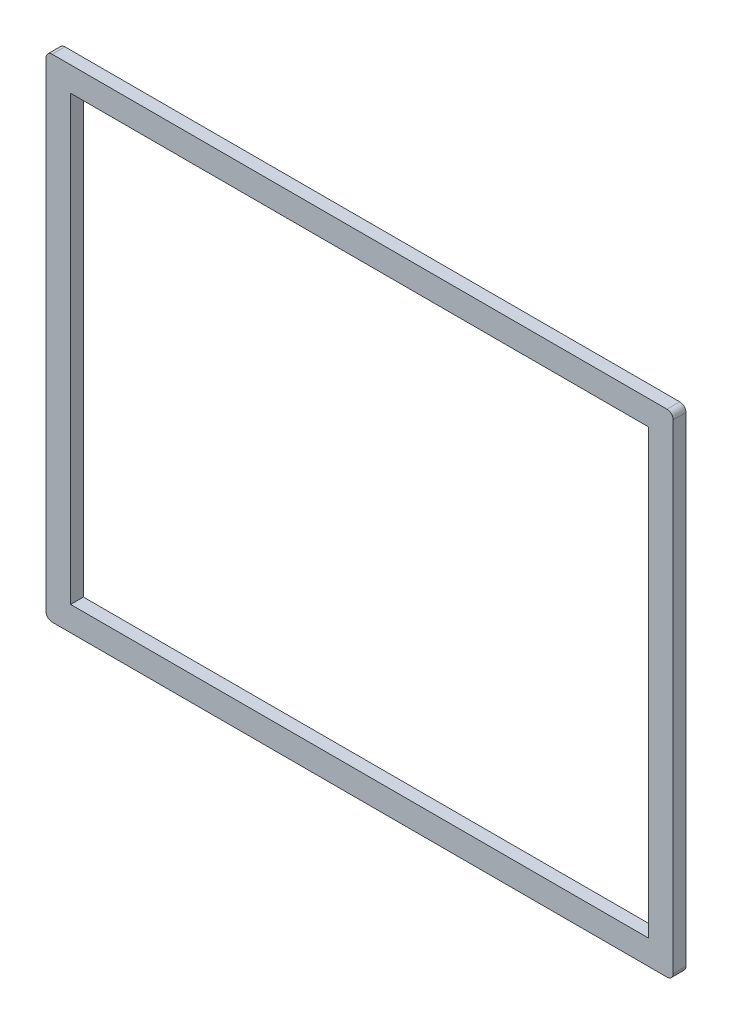
ISO-10303-21;
HEADER;
FILE_DESCRIPTION(('STEP AP214'),'2;1');
FILE_NAME('part.step','',(''),(''),'','','');
FILE_SCHEMA(('AUTOMOTIVE_DESIGN { 1 0 10303 214 1 1 1 1 }'));
ENDSEC;
DATA;
#1=APPLICATION_CONTEXT('core data for automotive mechanical design processes');
#2=APPLICATION_PROTOCOL_DEFINITION('international standard','automotive_design',2000,#1);
#3=PRODUCT_CONTEXT('',#1,'mechanical');
#4=PRODUCT('Part','Part','',(#3));
#5=PRODUCT_RELATED_PRODUCT_CATEGORY('part','',(#4));
#6=PRODUCT_DEFINITION_FORMATION('','',#4);
#7=PRODUCT_DEFINITION_CONTEXT('part definition',#1,'design');
#8=PRODUCT_DEFINITION('design','',#6,#7);
#9=PRODUCT_DEFINITION_SHAPE('','',#8);
#10=(LENGTH_UNIT() NAMED_UNIT(*) SI_UNIT(.MILLI.,.METRE.));
#11=(NAMED_UNIT(*) PLANE_ANGLE_UNIT() SI_UNIT($,.RADIAN.));
#12=(NAMED_UNIT(*) SI_UNIT($,.STERADIAN.) SOLID_ANGLE_UNIT());
#13=UNCERTAINTY_MEASURE_WITH_UNIT(LENGTH_MEASURE(1.E-05),#10,'distance_accuracy_value','');
#14=(GEOMETRIC_REPRESENTATION_CONTEXT(3) GLOBAL_UNCERTAINTY_ASSIGNED_CONTEXT((#13)) GLOBAL_UNIT_ASSIGNED_CONTEXT((#10,
#11,#12)) REPRESENTATION_CONTEXT('',''));
#15=CARTESIAN_POINT('',(0.,0.,0.));
#16=DIRECTION('',(0.,0.,1.));
#17=DIRECTION('',(1.,0.,0.));
#18=AXIS2_PLACEMENT_3D('',#15,#16,#17);
#19=CARTESIAN_POINT('',(-323.85,254.,-13.208));
#20=DIRECTION('',(0.,1.,0.));
#21=DIRECTION('',(0.,0.,1.));
#22=AXIS2_PLACEMENT_3D('',#19,#20,#21);
#23=PLANE('',#22);
#24=DIRECTION('',(-1.,0.,0.));
#25=VECTOR('',#24,1.);
#26=CARTESIAN_POINT('',(-323.85,254.,0.));
#27=LINE('',#26,#25);
#28=CARTESIAN_POINT('',(317.5,254.,0.));
#29=VERTEX_POINT('',#28);
#30=CARTESIAN_POINT('',(-317.5,254.,0.));
#31=VERTEX_POINT('',#30);
#32=EDGE_CURVE('E160',#29,#31,#27,.T.);
#33=ORIENTED_EDGE('',*,*,#32,.F.);
#34=DIRECTION('',(0.,0.,1.));
#35=VECTOR('',#34,1.);
#36=CARTESIAN_POINT('',(317.5,254.,-13.208));
#37=LINE('',#36,#35);
#38=CARTESIAN_POINT('',(317.5,254.,-13.208));
#39=VERTEX_POINT('',#38);
#40=EDGE_CURVE('E11',#29,#39,#37,.F.);
#41=ORIENTED_EDGE('',*,*,#40,.T.);
#42=DIRECTION('',(-1.,0.,0.));
#43=VECTOR('',#42,1.);
#44=CARTESIAN_POINT('',(-323.85,254.,-13.208));
#45=LINE('',#44,#43);
#46=CARTESIAN_POINT('',(-317.5,254.,-13.208));
#47=VERTEX_POINT('',#46);
#48=EDGE_CURVE('E164',#39,#47,#45,.T.);
#49=ORIENTED_EDGE('',*,*,#48,.T.);
#50=DIRECTION('',(0.,0.,1.));
#51=VECTOR('',#50,1.);
#52=CARTESIAN_POINT('',(-317.5,254.,-13.208));
#53=LINE('',#52,#51);
#54=EDGE_CURVE('E39',#47,#31,#53,.T.);
#55=ORIENTED_EDGE('',*,*,#54,.T.);
#56=EDGE_LOOP('',(#33,#41,#49,#55));
#57=FACE_BOUND('',#56,.T.);
#58=ADVANCED_FACE('F31',(#57),#23,.T.);
#59=CARTESIAN_POINT('',(323.85,254.,-13.208));
#60=DIRECTION('',(1.,0.,0.));
#61=DIRECTION('',(0.,1.,0.));
#62=AXIS2_PLACEMENT_3D('',#59,#60,#61);
#63=PLANE('',#62);
#64=DIRECTION('',(0.,1.,0.));
#65=VECTOR('',#64,1.);
#66=CARTESIAN_POINT('',(323.85,254.,0.));
#67=LINE('',#66,#65);
#68=CARTESIAN_POINT('',(323.85,-247.65,0.));
#69=VERTEX_POINT('',#68);
#70=CARTESIAN_POINT('',(323.85,247.65,0.));
#71=VERTEX_POINT('',#70);
#72=EDGE_CURVE('E168',#69,#71,#67,.T.);
#73=ORIENTED_EDGE('',*,*,#72,.F.);
#74=DIRECTION('',(0.,0.,1.));
#75=VECTOR('',#74,1.);
#76=CARTESIAN_POINT('',(323.85,-247.65,-13.208));
#77=LINE('',#76,#75);
#78=CARTESIAN_POINT('',(323.85,-247.65,-13.208));
#79=VERTEX_POINT('',#78);
#80=EDGE_CURVE('E53',#69,#79,#77,.F.);
#81=ORIENTED_EDGE('',*,*,#80,.T.);
#82=DIRECTION('',(0.,1.,0.));
#83=VECTOR('',#82,1.);
#84=CARTESIAN_POINT('',(323.85,254.,-13.208));
#85=LINE('',#84,#83);
#86=CARTESIAN_POINT('',(323.85,247.65,-13.208));
#87=VERTEX_POINT('',#86);
#88=EDGE_CURVE('E174',#79,#87,#85,.T.);
#89=ORIENTED_EDGE('',*,*,#88,.T.);
#90=DIRECTION('',(0.,0.,1.));
#91=VECTOR('',#90,1.);
#92=CARTESIAN_POINT('',(323.85,247.65,-13.208));
#93=LINE('',#92,#91);
#94=EDGE_CURVE('E211',#87,#71,#93,.T.);
#95=ORIENTED_EDGE('',*,*,#94,.T.);
#96=EDGE_LOOP('',(#73,#81,#89,#95));
#97=FACE_BOUND('',#96,.T.);
#98=ADVANCED_FACE('F227',(#97),#63,.T.);
#99=CARTESIAN_POINT('',(-323.85,-254.,-13.208));
#100=DIRECTION('',(0.,-1.,0.));
#101=DIRECTION('',(1.,0.,0.));
#102=AXIS2_PLACEMENT_3D('',#99,#100,#101);
#103=PLANE('',#102);
#104=DIRECTION('',(1.,0.,0.));
#105=VECTOR('',#104,1.);
#106=CARTESIAN_POINT('',(-323.85,-254.,0.));
#107=LINE('',#106,#105);
#108=CARTESIAN_POINT('',(-317.5,-254.,0.));
#109=VERTEX_POINT('',#108);
#110=CARTESIAN_POINT('',(317.5,-254.,0.));
#111=VERTEX_POINT('',#110);
#112=EDGE_CURVE('E182',#109,#111,#107,.T.);
#113=ORIENTED_EDGE('',*,*,#112,.F.);
#114=DIRECTION('',(0.,0.,1.));
#115=VECTOR('',#114,1.);
#116=CARTESIAN_POINT('',(-317.5,-254.,-13.208));
#117=LINE('',#116,#115);
#118=CARTESIAN_POINT('',(-317.5,-254.,-13.208));
#119=VERTEX_POINT('',#118);
#120=EDGE_CURVE('E202',#109,#119,#117,.F.);
#121=ORIENTED_EDGE('',*,*,#120,.T.);
#122=DIRECTION('',(1.,0.,0.));
#123=VECTOR('',#122,1.);
#124=CARTESIAN_POINT('',(-323.85,-254.,-13.208));
#125=LINE('',#124,#123);
#126=CARTESIAN_POINT('',(317.5,-254.,-13.208));
#127=VERTEX_POINT('',#126);
#128=EDGE_CURVE('E171',#119,#127,#125,.T.);
#129=ORIENTED_EDGE('',*,*,#128,.T.);
#130=DIRECTION('',(0.,0.,1.));
#131=VECTOR('',#130,1.);
#132=CARTESIAN_POINT('',(317.5,-254.,-13.208));
#133=LINE('',#132,#131);
#134=EDGE_CURVE('E199',#127,#111,#133,.T.);
#135=ORIENTED_EDGE('',*,*,#134,.T.);
#136=EDGE_LOOP('',(#113,#121,#129,#135));
#137=FACE_BOUND('',#136,.T.);
#138=ADVANCED_FACE('F235',(#137),#103,.T.);
#139=CARTESIAN_POINT('',(-323.85,254.,-13.208));
#140=DIRECTION('',(-1.,0.,0.));
#141=DIRECTION('',(0.,-1.,0.));
#142=AXIS2_PLACEMENT_3D('',#139,#140,#141);
#143=PLANE('',#142);
#144=DIRECTION('',(0.,-1.,0.));
#145=VECTOR('',#144,1.);
#146=CARTESIAN_POINT('',(-323.85,254.,-13.208));
#147=LINE('',#146,#145);
#148=CARTESIAN_POINT('',(-323.85,247.65,-13.208));
#149=VERTEX_POINT('',#148);
#150=CARTESIAN_POINT('',(-323.85,-247.65,-13.208));
#151=VERTEX_POINT('',#150);
#152=EDGE_CURVE('E167',#149,#151,#147,.T.);
#153=ORIENTED_EDGE('',*,*,#152,.T.);
#154=DIRECTION('',(0.,0.,1.));
#155=VECTOR('',#154,1.);
#156=CARTESIAN_POINT('',(-323.85,-247.65,-13.208));
#157=LINE('',#156,#155);
#158=CARTESIAN_POINT('',(-323.85,-247.65,0.));
#159=VERTEX_POINT('',#158);
#160=EDGE_CURVE('E188',#151,#159,#157,.T.);
#161=ORIENTED_EDGE('',*,*,#160,.T.);
#162=DIRECTION('',(0.,-1.,0.));
#163=VECTOR('',#162,1.);
#164=CARTESIAN_POINT('',(-323.85,254.,0.));
#165=LINE('',#164,#163);
#166=CARTESIAN_POINT('',(-323.85,247.65,0.));
#167=VERTEX_POINT('',#166);
#168=EDGE_CURVE('E179',#167,#159,#165,.T.);
#169=ORIENTED_EDGE('',*,*,#168,.F.);
#170=DIRECTION('',(0.,0.,1.));
#171=VECTOR('',#170,1.);
#172=CARTESIAN_POINT('',(-323.85,247.65,-13.208));
#173=LINE('',#172,#171);
#174=EDGE_CURVE('E176',#167,#149,#173,.F.);
#175=ORIENTED_EDGE('',*,*,#174,.T.);
#176=EDGE_LOOP('',(#153,#161,#169,#175));
#177=FACE_BOUND('',#176,.T.);
#178=ADVANCED_FACE('F242',(#177),#143,.T.);
#179=CARTESIAN_POINT('',(323.85,254.,-13.208));
#180=DIRECTION('',(0.,0.,-1.));
#181=DIRECTION('',(-1.,0.,0.));
#182=AXIS2_PLACEMENT_3D('',#179,#180,#181);
#183=PLANE('',#182);
#184=DIRECTION('',(0.,-1.,0.));
#185=VECTOR('',#184,1.);
#186=CARTESIAN_POINT('',(-298.45,228.6,-13.208));
#187=LINE('',#186,#185);
#188=CARTESIAN_POINT('',(-298.45,228.6,-13.208));
#189=VERTEX_POINT('',#188);
#190=CARTESIAN_POINT('',(-298.45,-228.6,-13.208));
#191=VERTEX_POINT('',#190);
#192=EDGE_CURVE('E125',#189,#191,#187,.T.);
#193=ORIENTED_EDGE('',*,*,#192,.T.);
#194=DIRECTION('',(1.,0.,0.));
#195=VECTOR('',#194,1.);
#196=CARTESIAN_POINT('',(-298.45,-228.6,-13.208));
#197=LINE('',#196,#195);
#198=CARTESIAN_POINT('',(298.45,-228.6,-13.208));
#199=VERTEX_POINT('',#198);
#200=EDGE_CURVE('E137',#191,#199,#197,.T.);
#201=ORIENTED_EDGE('',*,*,#200,.T.);
#202=DIRECTION('',(0.,1.,0.));
#203=VECTOR('',#202,1.);
#204=CARTESIAN_POINT('',(298.45,228.6,-13.208));
#205=LINE('',#204,#203);
#206=CARTESIAN_POINT('',(298.45,228.6,-13.208));
#207=VERTEX_POINT('',#206);
#208=EDGE_CURVE('E141',#199,#207,#205,.T.);
#209=ORIENTED_EDGE('',*,*,#208,.T.);
#210=DIRECTION('',(-1.,0.,0.));
#211=VECTOR('',#210,1.);
#212=CARTESIAN_POINT('',(-298.45,228.6,-13.208));
#213=LINE('',#212,#211);
#214=EDGE_CURVE('E133',#207,#189,#213,.T.);
#215=ORIENTED_EDGE('',*,*,#214,.T.);
#216=EDGE_LOOP('',(#193,#201,#209,#215));
#217=FACE_BOUND('',#216,.T.);
#218=ORIENTED_EDGE('',*,*,#128,.F.);
#219=CARTESIAN_POINT('',(-317.5,-247.65,-13.208));
#220=DIRECTION('',(0.,0.,-1.));
#221=DIRECTION('',(-1.,0.,0.));
#222=AXIS2_PLACEMENT_3D('',#219,#220,#221);
#223=CIRCLE('',#222,6.35);
#224=EDGE_CURVE('E209',#119,#151,#223,.T.);
#225=ORIENTED_EDGE('',*,*,#224,.T.);
#226=ORIENTED_EDGE('',*,*,#152,.F.);
#227=CARTESIAN_POINT('',(-317.5,247.65,-13.208));
#228=DIRECTION('',(0.,0.,-1.));
#229=DIRECTION('',(-1.,0.,0.));
#230=AXIS2_PLACEMENT_3D('',#227,#228,#229);
#231=CIRCLE('',#230,6.35);
#232=EDGE_CURVE('E204',#149,#47,#231,.T.);
#233=ORIENTED_EDGE('',*,*,#232,.T.);
#234=ORIENTED_EDGE('',*,*,#48,.F.);
#235=CARTESIAN_POINT('',(317.5,247.65,-13.208));
#236=DIRECTION('',(0.,0.,-1.));
#237=DIRECTION('',(-1.,0.,0.));
#238=AXIS2_PLACEMENT_3D('',#235,#236,#237);
#239=CIRCLE('',#238,6.35);
#240=EDGE_CURVE('E46',#39,#87,#239,.T.);
#241=ORIENTED_EDGE('',*,*,#240,.T.);
#242=ORIENTED_EDGE('',*,*,#88,.F.);
#243=CARTESIAN_POINT('',(317.5,-247.65,-13.208));
#244=DIRECTION('',(0.,0.,-1.));
#245=DIRECTION('',(-1.,0.,0.));
#246=AXIS2_PLACEMENT_3D('',#243,#244,#245);
#247=CIRCLE('',#246,6.35);
#248=EDGE_CURVE('E207',#79,#127,#247,.T.);
#249=ORIENTED_EDGE('',*,*,#248,.T.);
#250=EDGE_LOOP('',(#218,#225,#226,#233,#234,#241,#242,#249));
#251=FACE_BOUND('',#250,.T.);
#252=ADVANCED_FACE('F143',(#217,#251),#183,.T.);
#253=CARTESIAN_POINT('',(323.85,254.,0.));
#254=DIRECTION('',(0.,0.,-1.));
#255=DIRECTION('',(-1.,0.,0.));
#256=AXIS2_PLACEMENT_3D('',#253,#254,#255);
#257=PLANE('',#256);
#258=DIRECTION('',(1.,0.,0.));
#259=VECTOR('',#258,1.);
#260=CARTESIAN_POINT('',(-298.45,-228.6,0.));
#261=LINE('',#260,#259);
#262=CARTESIAN_POINT('',(-298.45,-228.6,0.));
#263=VERTEX_POINT('',#262);
#264=CARTESIAN_POINT('',(298.45,-228.6,0.));
#265=VERTEX_POINT('',#264);
#266=EDGE_CURVE('E154',#263,#265,#261,.T.);
#267=ORIENTED_EDGE('',*,*,#266,.F.);
#268=DIRECTION('',(0.,-1.,0.));
#269=VECTOR('',#268,1.);
#270=CARTESIAN_POINT('',(-298.45,228.6,0.));
#271=LINE('',#270,#269);
#272=CARTESIAN_POINT('',(-298.45,228.6,0.));
#273=VERTEX_POINT('',#272);
#274=EDGE_CURVE('E128',#273,#263,#271,.T.);
#275=ORIENTED_EDGE('',*,*,#274,.F.);
#276=DIRECTION('',(-1.,0.,0.));
#277=VECTOR('',#276,1.);
#278=CARTESIAN_POINT('',(-298.45,228.6,0.));
#279=LINE('',#278,#277);
#280=CARTESIAN_POINT('',(298.45,228.6,0.));
#281=VERTEX_POINT('',#280);
#282=EDGE_CURVE('E145',#281,#273,#279,.T.);
#283=ORIENTED_EDGE('',*,*,#282,.F.);
#284=DIRECTION('',(0.,1.,0.));
#285=VECTOR('',#284,1.);
#286=CARTESIAN_POINT('',(298.45,228.6,0.));
#287=LINE('',#286,#285);
#288=EDGE_CURVE('E148',#265,#281,#287,.T.);
#289=ORIENTED_EDGE('',*,*,#288,.F.);
#290=EDGE_LOOP('',(#267,#275,#283,#289));
#291=FACE_BOUND('',#290,.T.);
#292=ORIENTED_EDGE('',*,*,#168,.T.);
#293=CARTESIAN_POINT('',(-317.5,-247.65,0.));
#294=DIRECTION('',(0.,0.,-1.));
#295=DIRECTION('',(-1.,0.,0.));
#296=AXIS2_PLACEMENT_3D('',#293,#294,#295);
#297=CIRCLE('',#296,6.35);
#298=EDGE_CURVE('E197',#159,#109,#297,.F.);
#299=ORIENTED_EDGE('',*,*,#298,.T.);
#300=ORIENTED_EDGE('',*,*,#112,.T.);
#301=CARTESIAN_POINT('',(317.5,-247.65,0.));
#302=DIRECTION('',(0.,0.,-1.));
#303=DIRECTION('',(-1.,0.,0.));
#304=AXIS2_PLACEMENT_3D('',#301,#302,#303);
#305=CIRCLE('',#304,6.35);
#306=EDGE_CURVE('E195',#111,#69,#305,.F.);
#307=ORIENTED_EDGE('',*,*,#306,.T.);
#308=ORIENTED_EDGE('',*,*,#72,.T.);
#309=CARTESIAN_POINT('',(317.5,247.65,0.));
#310=DIRECTION('',(0.,0.,-1.));
#311=DIRECTION('',(-1.,0.,0.));
#312=AXIS2_PLACEMENT_3D('',#309,#310,#311);
#313=CIRCLE('',#312,6.35);
#314=EDGE_CURVE('E193',#71,#29,#313,.F.);
#315=ORIENTED_EDGE('',*,*,#314,.T.);
#316=ORIENTED_EDGE('',*,*,#32,.T.);
#317=CARTESIAN_POINT('',(-317.5,247.65,0.));
#318=DIRECTION('',(0.,0.,-1.));
#319=DIRECTION('',(-1.,0.,0.));
#320=AXIS2_PLACEMENT_3D('',#317,#318,#319);
#321=CIRCLE('',#320,6.35);
#322=EDGE_CURVE('E191',#31,#167,#321,.F.);
#323=ORIENTED_EDGE('',*,*,#322,.T.);
#324=EDGE_LOOP('',(#292,#299,#300,#307,#308,#315,#316,#323));
#325=FACE_BOUND('',#324,.T.);
#326=ADVANCED_FACE('F222',(#291,#325),#257,.F.);
#327=CARTESIAN_POINT('',(-298.45,228.6,-13.208));
#328=DIRECTION('',(-1.,0.,0.));
#329=DIRECTION('',(0.,-1.,0.));
#330=AXIS2_PLACEMENT_3D('',#327,#328,#329);
#331=PLANE('',#330);
#332=ORIENTED_EDGE('',*,*,#274,.T.);
#333=DIRECTION('',(0.,0.,1.));
#334=VECTOR('',#333,1.);
#335=CARTESIAN_POINT('',(-298.45,-228.6,-13.208));
#336=LINE('',#335,#334);
#337=EDGE_CURVE('E121',#191,#263,#336,.T.);
#338=ORIENTED_EDGE('',*,*,#337,.F.);
#339=ORIENTED_EDGE('',*,*,#192,.F.);
#340=DIRECTION('',(0.,0.,1.));
#341=VECTOR('',#340,1.);
#342=CARTESIAN_POINT('',(-298.45,228.6,-13.208));
#343=LINE('',#342,#341);
#344=EDGE_CURVE('E158',#189,#273,#343,.T.);
#345=ORIENTED_EDGE('',*,*,#344,.T.);
#346=EDGE_LOOP('',(#332,#338,#339,#345));
#347=FACE_BOUND('',#346,.T.);
#348=ADVANCED_FACE('F123',(#347),#331,.F.);
#349=CARTESIAN_POINT('',(-298.45,228.6,-13.208));
#350=DIRECTION('',(0.,1.,0.));
#351=DIRECTION('',(0.,0.,1.));
#352=AXIS2_PLACEMENT_3D('',#349,#350,#351);
#353=PLANE('',#352);
#354=ORIENTED_EDGE('',*,*,#282,.T.);
#355=ORIENTED_EDGE('',*,*,#344,.F.);
#356=ORIENTED_EDGE('',*,*,#214,.F.);
#357=DIRECTION('',(0.,0.,1.));
#358=VECTOR('',#357,1.);
#359=CARTESIAN_POINT('',(298.45,228.6,-13.208));
#360=LINE('',#359,#358);
#361=EDGE_CURVE('E161',#207,#281,#360,.T.);
#362=ORIENTED_EDGE('',*,*,#361,.T.);
#363=EDGE_LOOP('',(#354,#355,#356,#362));
#364=FACE_BOUND('',#363,.T.);
#365=ADVANCED_FACE('F298',(#364),#353,.F.);
#366=CARTESIAN_POINT('',(298.45,228.6,-13.208));
#367=DIRECTION('',(1.,0.,0.));
#368=DIRECTION('',(0.,1.,0.));
#369=AXIS2_PLACEMENT_3D('',#366,#367,#368);
#370=PLANE('',#369);
#371=ORIENTED_EDGE('',*,*,#288,.T.);
#372=ORIENTED_EDGE('',*,*,#361,.F.);
#373=ORIENTED_EDGE('',*,*,#208,.F.);
#374=DIRECTION('',(0.,0.,1.));
#375=VECTOR('',#374,1.);
#376=CARTESIAN_POINT('',(298.45,-228.6,-13.208));
#377=LINE('',#376,#375);
#378=EDGE_CURVE('E132',#199,#265,#377,.T.);
#379=ORIENTED_EDGE('',*,*,#378,.T.);
#380=EDGE_LOOP('',(#371,#372,#373,#379));
#381=FACE_BOUND('',#380,.T.);
#382=ADVANCED_FACE('F290',(#381),#370,.F.);
#383=CARTESIAN_POINT('',(-298.45,-228.6,-13.208));
#384=DIRECTION('',(0.,-1.,0.));
#385=DIRECTION('',(0.,0.,-1.));
#386=AXIS2_PLACEMENT_3D('',#383,#384,#385);
#387=PLANE('',#386);
#388=ORIENTED_EDGE('',*,*,#266,.T.);
#389=ORIENTED_EDGE('',*,*,#378,.F.);
#390=ORIENTED_EDGE('',*,*,#200,.F.);
#391=ORIENTED_EDGE('',*,*,#337,.T.);
#392=EDGE_LOOP('',(#388,#389,#390,#391));
#393=FACE_BOUND('',#392,.T.);
#394=ADVANCED_FACE('F138',(#393),#387,.F.);
#395=CARTESIAN_POINT('',(-317.5,-247.65,-13.208));
#396=DIRECTION('',(0.,0.,1.));
#397=DIRECTION('',(1.,0.,0.));
#398=AXIS2_PLACEMENT_3D('',#395,#396,#397);
#399=CYLINDRICAL_SURFACE('',#398,6.35);
#400=ORIENTED_EDGE('',*,*,#224,.F.);
#401=ORIENTED_EDGE('',*,*,#120,.F.);
#402=ORIENTED_EDGE('',*,*,#298,.F.);
#403=ORIENTED_EDGE('',*,*,#160,.F.);
#404=EDGE_LOOP('',(#400,#401,#402,#403));
#405=FACE_BOUND('',#404,.T.);
#406=ADVANCED_FACE('F240',(#405),#399,.T.);
#407=CARTESIAN_POINT('',(317.5,-247.65,-13.208));
#408=DIRECTION('',(0.,0.,1.));
#409=DIRECTION('',(1.,0.,0.));
#410=AXIS2_PLACEMENT_3D('',#407,#408,#409);
#411=CYLINDRICAL_SURFACE('',#410,6.35);
#412=ORIENTED_EDGE('',*,*,#248,.F.);
#413=ORIENTED_EDGE('',*,*,#80,.F.);
#414=ORIENTED_EDGE('',*,*,#306,.F.);
#415=ORIENTED_EDGE('',*,*,#134,.F.);
#416=EDGE_LOOP('',(#412,#413,#414,#415));
#417=FACE_BOUND('',#416,.T.);
#418=ADVANCED_FACE('F232',(#417),#411,.T.);
#419=CARTESIAN_POINT('',(317.5,247.65,-13.208));
#420=DIRECTION('',(0.,0.,1.));
#421=DIRECTION('',(1.,0.,0.));
#422=AXIS2_PLACEMENT_3D('',#419,#420,#421);
#423=CYLINDRICAL_SURFACE('',#422,6.35);
#424=ORIENTED_EDGE('',*,*,#240,.F.);
#425=ORIENTED_EDGE('',*,*,#40,.F.);
#426=ORIENTED_EDGE('',*,*,#314,.F.);
#427=ORIENTED_EDGE('',*,*,#94,.F.);
#428=EDGE_LOOP('',(#424,#425,#426,#427));
#429=FACE_BOUND('',#428,.T.);
#430=ADVANCED_FACE('F226',(#429),#423,.T.);
#431=CARTESIAN_POINT('',(-317.5,247.65,-13.208));
#432=DIRECTION('',(0.,0.,1.));
#433=DIRECTION('',(1.,0.,0.));
#434=AXIS2_PLACEMENT_3D('',#431,#432,#433);
#435=CYLINDRICAL_SURFACE('',#434,6.35);
#436=ORIENTED_EDGE('',*,*,#232,.F.);
#437=ORIENTED_EDGE('',*,*,#174,.F.);
#438=ORIENTED_EDGE('',*,*,#322,.F.);
#439=ORIENTED_EDGE('',*,*,#54,.F.);
#440=EDGE_LOOP('',(#436,#437,#438,#439));
#441=FACE_BOUND('',#440,.T.);
#442=ADVANCED_FACE('F33',(#441),#435,.T.);
#443=CLOSED_SHELL('',(#58,#98,#138,#178,#252,#326,#348,#365,#382,#394,#406,#418,#430,#442));
#444=MANIFOLD_SOLID_BREP('B2',#443);
#445=ADVANCED_BREP_SHAPE_REPRESENTATION('',(#18,#444),#14);
#446=SHAPE_DEFINITION_REPRESENTATION(#9,#445);
ENDSEC;
END-ISO-10303-21;
